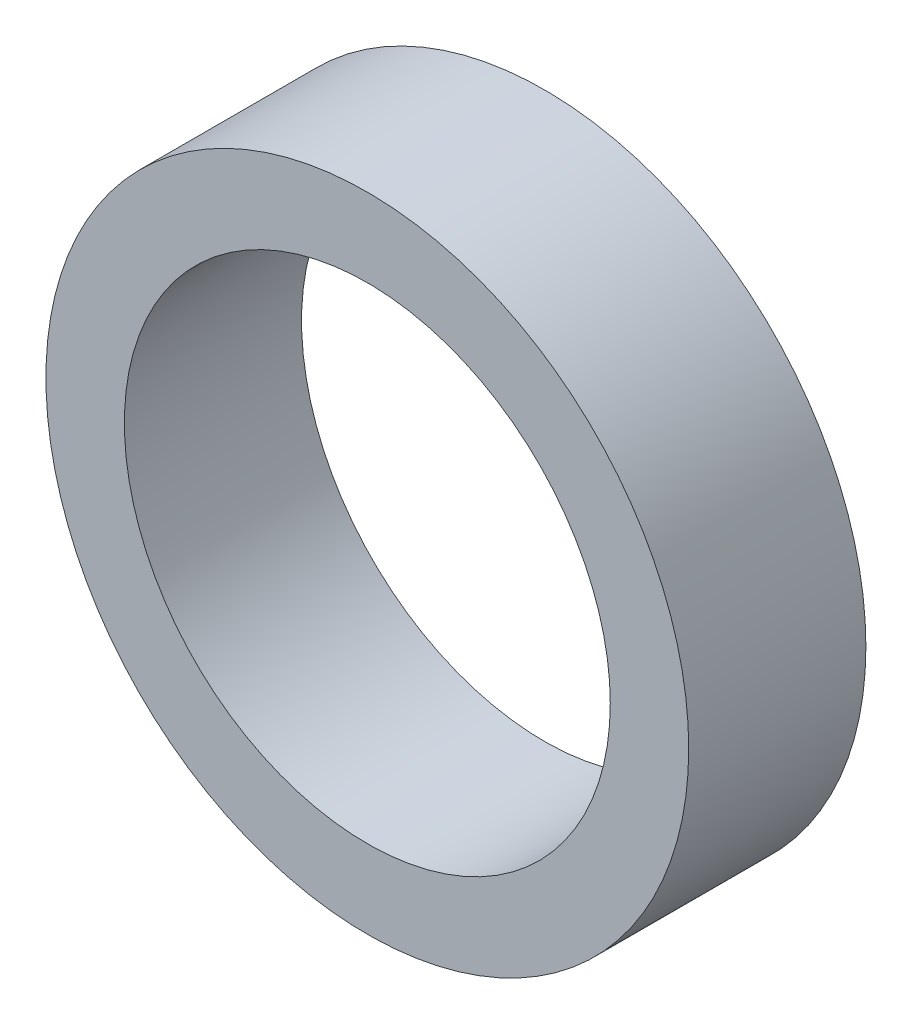
ISO-10303-21;
HEADER;
FILE_DESCRIPTION(('STEP AP214'),'2;1');
FILE_NAME('part.step','',(''),(''),'','','');
FILE_SCHEMA(('AUTOMOTIVE_DESIGN { 1 0 10303 214 1 1 1 1 }'));
ENDSEC;
DATA;
#1=APPLICATION_CONTEXT('core data for automotive mechanical design processes');
#2=APPLICATION_PROTOCOL_DEFINITION('international standard','automotive_design',2000,#1);
#3=PRODUCT_CONTEXT('',#1,'mechanical');
#4=PRODUCT('Part','Part','',(#3));
#5=PRODUCT_RELATED_PRODUCT_CATEGORY('part','',(#4));
#6=PRODUCT_DEFINITION_FORMATION('','',#4);
#7=PRODUCT_DEFINITION_CONTEXT('part definition',#1,'design');
#8=PRODUCT_DEFINITION('design','',#6,#7);
#9=PRODUCT_DEFINITION_SHAPE('','',#8);
#10=(LENGTH_UNIT() NAMED_UNIT(*) SI_UNIT(.MILLI.,.METRE.));
#11=(NAMED_UNIT(*) PLANE_ANGLE_UNIT() SI_UNIT($,.RADIAN.));
#12=(NAMED_UNIT(*) SI_UNIT($,.STERADIAN.) SOLID_ANGLE_UNIT());
#13=UNCERTAINTY_MEASURE_WITH_UNIT(LENGTH_MEASURE(1.E-05),#10,'distance_accuracy_value','');
#14=(GEOMETRIC_REPRESENTATION_CONTEXT(3) GLOBAL_UNCERTAINTY_ASSIGNED_CONTEXT((#13)) GLOBAL_UNIT_ASSIGNED_CONTEXT((#10,
#11,#12)) REPRESENTATION_CONTEXT('',''));
#15=CARTESIAN_POINT('',(0.,0.,0.));
#16=DIRECTION('',(0.,0.,1.));
#17=DIRECTION('',(1.,0.,0.));
#18=AXIS2_PLACEMENT_3D('',#15,#16,#17);
#19=CARTESIAN_POINT('',(0.,0.,35.));
#20=DIRECTION('',(0.,0.,1.));
#21=DIRECTION('',(1.,0.,0.));
#22=AXIS2_PLACEMENT_3D('',#19,#20,#21);
#23=PLANE('',#22);
#24=CARTESIAN_POINT('',(0.,0.,35.));
#25=DIRECTION('',(0.,0.,1.));
#26=DIRECTION('',(1.,0.,0.));
#27=AXIS2_PLACEMENT_3D('',#24,#25,#26);
#28=CIRCLE('',#27,127.);
#29=CARTESIAN_POINT('',(127.,0.,35.));
#30=VERTEX_POINT('',#29);
#31=EDGE_CURVE('E10',#30,#30,#28,.T.);
#32=ORIENTED_EDGE('',*,*,#31,.T.);
#33=EDGE_LOOP('',(#32));
#34=FACE_BOUND('',#33,.T.);
#35=CARTESIAN_POINT('',(0.,0.,35.));
#36=DIRECTION('',(0.,0.,1.));
#37=DIRECTION('',(1.,0.,0.));
#38=AXIS2_PLACEMENT_3D('',#35,#36,#37);
#39=CIRCLE('',#38,96.);
#40=CARTESIAN_POINT('',(96.,0.,35.));
#41=VERTEX_POINT('',#40);
#42=EDGE_CURVE('E50',#41,#41,#39,.T.);
#43=ORIENTED_EDGE('',*,*,#42,.F.);
#44=EDGE_LOOP('',(#43));
#45=FACE_BOUND('',#44,.T.);
#46=ADVANCED_FACE('F36',(#34,#45),#23,.T.);
#47=CARTESIAN_POINT('',(0.,0.,-35.));
#48=DIRECTION('',(0.,0.,1.));
#49=DIRECTION('',(1.,0.,0.));
#50=AXIS2_PLACEMENT_3D('',#47,#48,#49);
#51=PLANE('',#50);
#52=CARTESIAN_POINT('',(0.,0.,-35.));
#53=DIRECTION('',(0.,0.,1.));
#54=DIRECTION('',(1.,0.,0.));
#55=AXIS2_PLACEMENT_3D('',#52,#53,#54);
#56=CIRCLE('',#55,127.);
#57=CARTESIAN_POINT('',(127.,0.,-35.));
#58=VERTEX_POINT('',#57);
#59=EDGE_CURVE('E40',#58,#58,#56,.T.);
#60=ORIENTED_EDGE('',*,*,#59,.F.);
#61=EDGE_LOOP('',(#60));
#62=FACE_BOUND('',#61,.T.);
#63=CARTESIAN_POINT('',(0.,0.,-35.));
#64=DIRECTION('',(0.,0.,1.));
#65=DIRECTION('',(1.,0.,0.));
#66=AXIS2_PLACEMENT_3D('',#63,#64,#65);
#67=CIRCLE('',#66,96.);
#68=CARTESIAN_POINT('',(96.,0.,-35.));
#69=VERTEX_POINT('',#68);
#70=EDGE_CURVE('E52',#69,#69,#67,.T.);
#71=ORIENTED_EDGE('',*,*,#70,.T.);
#72=EDGE_LOOP('',(#71));
#73=FACE_BOUND('',#72,.T.);
#74=ADVANCED_FACE('F63',(#62,#73),#51,.F.);
#75=CARTESIAN_POINT('',(0.,0.,35.));
#76=DIRECTION('',(0.,0.,-1.));
#77=DIRECTION('',(-1.,0.,0.));
#78=AXIS2_PLACEMENT_3D('',#75,#76,#77);
#79=CYLINDRICAL_SURFACE('',#78,127.);
#80=ORIENTED_EDGE('',*,*,#31,.F.);
#81=EDGE_LOOP('',(#80));
#82=FACE_BOUND('',#81,.T.);
#83=ORIENTED_EDGE('',*,*,#59,.T.);
#84=EDGE_LOOP('',(#83));
#85=FACE_BOUND('',#84,.T.);
#86=ADVANCED_FACE('F38',(#82,#85),#79,.T.);
#87=CARTESIAN_POINT('',(0.,0.,35.));
#88=DIRECTION('',(0.,0.,-1.));
#89=DIRECTION('',(-1.,0.,0.));
#90=AXIS2_PLACEMENT_3D('',#87,#88,#89);
#91=CYLINDRICAL_SURFACE('',#90,96.);
#92=ORIENTED_EDGE('',*,*,#42,.T.);
#93=EDGE_LOOP('',(#92));
#94=FACE_BOUND('',#93,.T.);
#95=ORIENTED_EDGE('',*,*,#70,.F.);
#96=EDGE_LOOP('',(#95));
#97=FACE_BOUND('',#96,.T.);
#98=ADVANCED_FACE('F59',(#94,#97),#91,.F.);
#99=CLOSED_SHELL('',(#46,#74,#86,#98));
#100=MANIFOLD_SOLID_BREP('B2',#99);
#101=ADVANCED_BREP_SHAPE_REPRESENTATION('',(#18,#100),#14);
#102=SHAPE_DEFINITION_REPRESENTATION(#9,#101);
ENDSEC;
END-ISO-10303-21;
